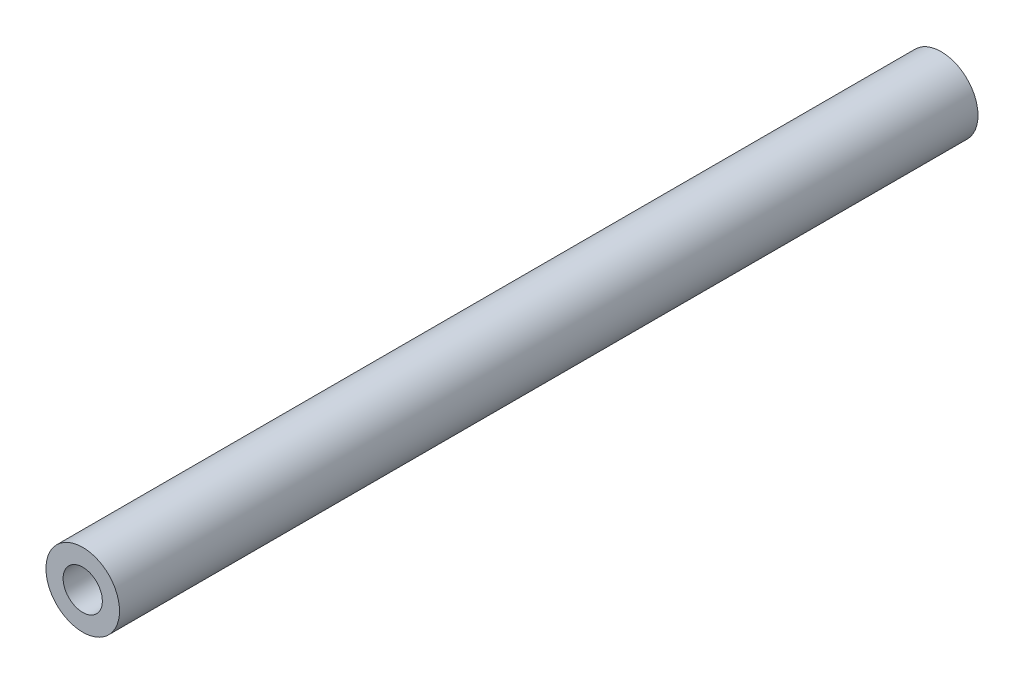
ISO-10303-21;
HEADER;
FILE_DESCRIPTION(('STEP AP214'),'2;1');
FILE_NAME('part.step','',(''),(''),'','','');
FILE_SCHEMA(('AUTOMOTIVE_DESIGN { 1 0 10303 214 1 1 1 1 }'));
ENDSEC;
DATA;
#1=APPLICATION_CONTEXT('core data for automotive mechanical design processes');
#2=APPLICATION_PROTOCOL_DEFINITION('international standard','automotive_design',2000,#1);
#3=PRODUCT_CONTEXT('',#1,'mechanical');
#4=PRODUCT('Part','Part','',(#3));
#5=PRODUCT_RELATED_PRODUCT_CATEGORY('part','',(#4));
#6=PRODUCT_DEFINITION_FORMATION('','',#4);
#7=PRODUCT_DEFINITION_CONTEXT('part definition',#1,'design');
#8=PRODUCT_DEFINITION('design','',#6,#7);
#9=PRODUCT_DEFINITION_SHAPE('','',#8);
#10=(LENGTH_UNIT() NAMED_UNIT(*) SI_UNIT(.MILLI.,.METRE.));
#11=(NAMED_UNIT(*) PLANE_ANGLE_UNIT() SI_UNIT($,.RADIAN.));
#12=(NAMED_UNIT(*) SI_UNIT($,.STERADIAN.) SOLID_ANGLE_UNIT());
#13=UNCERTAINTY_MEASURE_WITH_UNIT(LENGTH_MEASURE(1.E-05),#10,'distance_accuracy_value','');
#14=(GEOMETRIC_REPRESENTATION_CONTEXT(3) GLOBAL_UNCERTAINTY_ASSIGNED_CONTEXT((#13)) GLOBAL_UNIT_ASSIGNED_CONTEXT((#10,
#11,#12)) REPRESENTATION_CONTEXT('',''));
#15=CARTESIAN_POINT('',(0.,0.,0.));
#16=DIRECTION('',(0.,0.,1.));
#17=DIRECTION('',(1.,0.,0.));
#18=AXIS2_PLACEMENT_3D('',#15,#16,#17);
#19=CARTESIAN_POINT('',(0.,0.,70.));
#20=DIRECTION('',(0.,0.,1.));
#21=DIRECTION('',(1.,0.,0.));
#22=AXIS2_PLACEMENT_3D('',#19,#20,#21);
#23=PLANE('',#22);
#24=CARTESIAN_POINT('',(0.,0.,70.));
#25=DIRECTION('',(0.,0.,1.));
#26=DIRECTION('',(1.,0.,0.));
#27=AXIS2_PLACEMENT_3D('',#24,#25,#26);
#28=CIRCLE('',#27,3.);
#29=CARTESIAN_POINT('',(3.,0.,70.));
#30=VERTEX_POINT('',#29);
#31=EDGE_CURVE('E10',#30,#30,#28,.T.);
#32=ORIENTED_EDGE('',*,*,#31,.T.);
#33=EDGE_LOOP('',(#32));
#34=FACE_BOUND('',#33,.T.);
#35=CARTESIAN_POINT('',(0.,0.,70.));
#36=DIRECTION('',(0.,0.,1.));
#37=DIRECTION('',(1.,0.,0.));
#38=AXIS2_PLACEMENT_3D('',#35,#36,#37);
#39=CIRCLE('',#38,1.6);
#40=CARTESIAN_POINT('',(1.6,0.,70.));
#41=VERTEX_POINT('',#40);
#42=EDGE_CURVE('E48',#41,#41,#39,.T.);
#43=ORIENTED_EDGE('',*,*,#42,.F.);
#44=EDGE_LOOP('',(#43));
#45=FACE_BOUND('',#44,.T.);
#46=ADVANCED_FACE('F37',(#34,#45),#23,.T.);
#47=CARTESIAN_POINT('',(0.,0.,0.));
#48=DIRECTION('',(0.,0.,1.));
#49=DIRECTION('',(1.,0.,0.));
#50=AXIS2_PLACEMENT_3D('',#47,#48,#49);
#51=PLANE('',#50);
#52=CARTESIAN_POINT('',(0.,0.,0.));
#53=DIRECTION('',(0.,0.,1.));
#54=DIRECTION('',(1.,0.,0.));
#55=AXIS2_PLACEMENT_3D('',#52,#53,#54);
#56=CIRCLE('',#55,3.);
#57=CARTESIAN_POINT('',(3.,0.,0.));
#58=VERTEX_POINT('',#57);
#59=EDGE_CURVE('E41',#58,#58,#56,.T.);
#60=ORIENTED_EDGE('',*,*,#59,.F.);
#61=EDGE_LOOP('',(#60));
#62=FACE_BOUND('',#61,.T.);
#63=CARTESIAN_POINT('',(0.,0.,0.));
#64=DIRECTION('',(0.,0.,1.));
#65=DIRECTION('',(1.,0.,0.));
#66=AXIS2_PLACEMENT_3D('',#63,#64,#65);
#67=CIRCLE('',#66,1.6);
#68=CARTESIAN_POINT('',(1.6,0.,0.));
#69=VERTEX_POINT('',#68);
#70=EDGE_CURVE('E50',#69,#69,#67,.T.);
#71=ORIENTED_EDGE('',*,*,#70,.T.);
#72=EDGE_LOOP('',(#71));
#73=FACE_BOUND('',#72,.T.);
#74=ADVANCED_FACE('F60',(#62,#73),#51,.F.);
#75=CARTESIAN_POINT('',(0.,0.,70.));
#76=DIRECTION('',(0.,0.,-1.));
#77=DIRECTION('',(-1.,0.,0.));
#78=AXIS2_PLACEMENT_3D('',#75,#76,#77);
#79=CYLINDRICAL_SURFACE('',#78,3.);
#80=ORIENTED_EDGE('',*,*,#31,.F.);
#81=EDGE_LOOP('',(#80));
#82=FACE_BOUND('',#81,.T.);
#83=ORIENTED_EDGE('',*,*,#59,.T.);
#84=EDGE_LOOP('',(#83));
#85=FACE_BOUND('',#84,.T.);
#86=ADVANCED_FACE('F39',(#82,#85),#79,.T.);
#87=CARTESIAN_POINT('',(0.,0.,70.));
#88=DIRECTION('',(0.,0.,-1.));
#89=DIRECTION('',(-1.,0.,0.));
#90=AXIS2_PLACEMENT_3D('',#87,#88,#89);
#91=CYLINDRICAL_SURFACE('',#90,1.6);
#92=ORIENTED_EDGE('',*,*,#42,.T.);
#93=EDGE_LOOP('',(#92));
#94=FACE_BOUND('',#93,.T.);
#95=ORIENTED_EDGE('',*,*,#70,.F.);
#96=EDGE_LOOP('',(#95));
#97=FACE_BOUND('',#96,.T.);
#98=ADVANCED_FACE('F56',(#94,#97),#91,.F.);
#99=CLOSED_SHELL('',(#46,#74,#86,#98));
#100=MANIFOLD_SOLID_BREP('B2',#99);
#101=ADVANCED_BREP_SHAPE_REPRESENTATION('',(#18,#100),#14);
#102=SHAPE_DEFINITION_REPRESENTATION(#9,#101);
ENDSEC;
END-ISO-10303-21;
